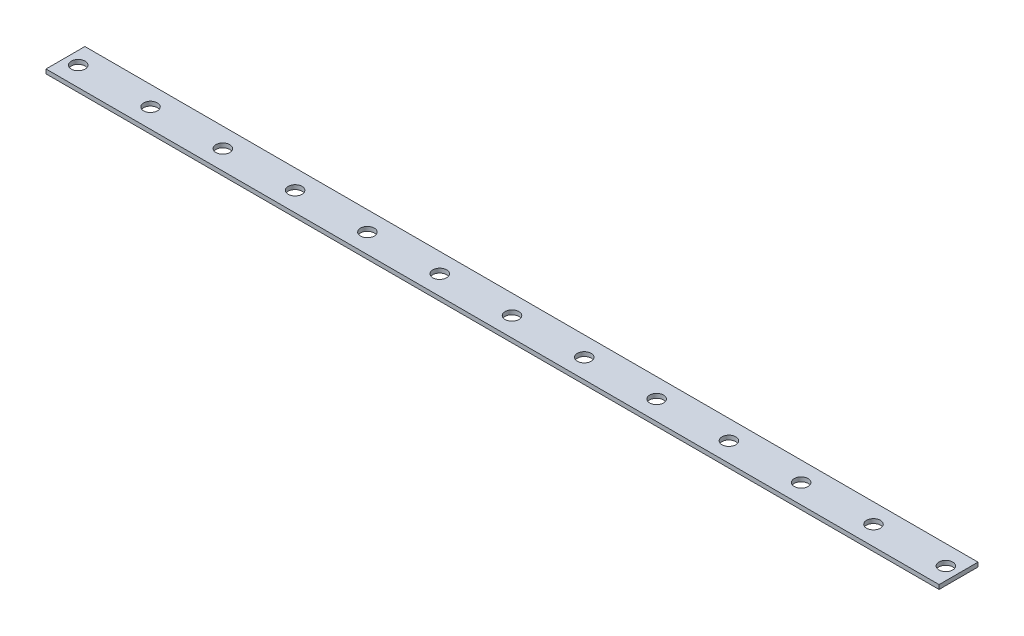
ISO-10303-21;
HEADER;
FILE_DESCRIPTION(('STEP AP214'),'2;1');
FILE_NAME('part.step','',(''),(''),'','','');
FILE_SCHEMA(('AUTOMOTIVE_DESIGN { 1 0 10303 214 1 1 1 1 }'));
ENDSEC;
DATA;
#1=APPLICATION_CONTEXT('core data for automotive mechanical design processes');
#2=APPLICATION_PROTOCOL_DEFINITION('international standard','automotive_design',2000,#1);
#3=PRODUCT_CONTEXT('',#1,'mechanical');
#4=PRODUCT('Part','Part','',(#3));
#5=PRODUCT_RELATED_PRODUCT_CATEGORY('part','',(#4));
#6=PRODUCT_DEFINITION_FORMATION('','',#4);
#7=PRODUCT_DEFINITION_CONTEXT('part definition',#1,'design');
#8=PRODUCT_DEFINITION('design','',#6,#7);
#9=PRODUCT_DEFINITION_SHAPE('','',#8);
#10=(LENGTH_UNIT() NAMED_UNIT(*) SI_UNIT(.MILLI.,.METRE.));
#11=(NAMED_UNIT(*) PLANE_ANGLE_UNIT() SI_UNIT($,.RADIAN.));
#12=(NAMED_UNIT(*) SI_UNIT($,.STERADIAN.) SOLID_ANGLE_UNIT());
#13=UNCERTAINTY_MEASURE_WITH_UNIT(LENGTH_MEASURE(1.E-05),#10,'distance_accuracy_value','');
#14=(GEOMETRIC_REPRESENTATION_CONTEXT(3) GLOBAL_UNCERTAINTY_ASSIGNED_CONTEXT((#13)) GLOBAL_UNIT_ASSIGNED_CONTEXT((#10,
#11,#12)) REPRESENTATION_CONTEXT('',''));
#15=CARTESIAN_POINT('',(0.,0.,0.));
#16=DIRECTION('',(0.,0.,1.));
#17=DIRECTION('',(1.,0.,0.));
#18=AXIS2_PLACEMENT_3D('',#15,#16,#17);
#19=CARTESIAN_POINT('',(0.,1.,0.));
#20=DIRECTION('',(0.,1.,0.));
#21=DIRECTION('',(0.,0.,1.));
#22=AXIS2_PLACEMENT_3D('',#19,#20,#21);
#23=PLANE('',#22);
#24=CARTESIAN_POINT('',(170.,1.,0.));
#25=DIRECTION('',(0.,1.,0.));
#26=DIRECTION('',(0.,0.,1.));
#27=AXIS2_PLACEMENT_3D('',#24,#25,#26);
#28=CIRCLE('',#27,3.24999999999995);
#29=CARTESIAN_POINT('',(170.,1.,3.24999999999995));
#30=VERTEX_POINT('',#29);
#31=EDGE_CURVE('E175',#30,#30,#28,.T.);
#32=ORIENTED_EDGE('',*,*,#31,.F.);
#33=EDGE_LOOP('',(#32));
#34=FACE_BOUND('',#33,.T.);
#35=CARTESIAN_POINT('',(102.,1.,0.));
#36=DIRECTION('',(0.,1.,0.));
#37=DIRECTION('',(0.,0.,1.));
#38=AXIS2_PLACEMENT_3D('',#35,#36,#37);
#39=CIRCLE('',#38,3.24999999999995);
#40=CARTESIAN_POINT('',(102.,1.,3.24999999999995));
#41=VERTEX_POINT('',#40);
#42=EDGE_CURVE('E163',#41,#41,#39,.T.);
#43=ORIENTED_EDGE('',*,*,#42,.F.);
#44=EDGE_LOOP('',(#43));
#45=FACE_BOUND('',#44,.T.);
#46=CARTESIAN_POINT('',(34.0000000000001,1.,0.));
#47=DIRECTION('',(0.,1.,0.));
#48=DIRECTION('',(0.,0.,1.));
#49=AXIS2_PLACEMENT_3D('',#46,#47,#48);
#50=CIRCLE('',#49,3.24999999999995);
#51=CARTESIAN_POINT('',(34.0000000000001,1.,3.24999999999995));
#52=VERTEX_POINT('',#51);
#53=EDGE_CURVE('E151',#52,#52,#50,.T.);
#54=ORIENTED_EDGE('',*,*,#53,.F.);
#55=EDGE_LOOP('',(#54));
#56=FACE_BOUND('',#55,.T.);
#57=CARTESIAN_POINT('',(-34.,1.,0.));
#58=DIRECTION('',(0.,1.,0.));
#59=DIRECTION('',(0.,0.,1.));
#60=AXIS2_PLACEMENT_3D('',#57,#58,#59);
#61=CIRCLE('',#60,3.24999999999996);
#62=CARTESIAN_POINT('',(-34.,1.,3.24999999999996));
#63=VERTEX_POINT('',#62);
#64=EDGE_CURVE('E139',#63,#63,#61,.T.);
#65=ORIENTED_EDGE('',*,*,#64,.F.);
#66=EDGE_LOOP('',(#65));
#67=FACE_BOUND('',#66,.T.);
#68=CARTESIAN_POINT('',(-102.,1.,0.));
#69=DIRECTION('',(0.,1.,0.));
#70=DIRECTION('',(0.,0.,1.));
#71=AXIS2_PLACEMENT_3D('',#68,#69,#70);
#72=CIRCLE('',#71,3.24999999999995);
#73=CARTESIAN_POINT('',(-102.,1.,3.24999999999995));
#74=VERTEX_POINT('',#73);
#75=EDGE_CURVE('E127',#74,#74,#72,.T.);
#76=ORIENTED_EDGE('',*,*,#75,.F.);
#77=EDGE_LOOP('',(#76));
#78=FACE_BOUND('',#77,.T.);
#79=CARTESIAN_POINT('',(-170.,1.,0.));
#80=DIRECTION('',(0.,1.,0.));
#81=DIRECTION('',(0.,0.,1.));
#82=AXIS2_PLACEMENT_3D('',#79,#80,#81);
#83=CIRCLE('',#82,3.24999999999995);
#84=CARTESIAN_POINT('',(-170.,1.,3.24999999999995));
#85=VERTEX_POINT('',#84);
#86=EDGE_CURVE('E115',#85,#85,#83,.T.);
#87=ORIENTED_EDGE('',*,*,#86,.F.);
#88=EDGE_LOOP('',(#87));
#89=FACE_BOUND('',#88,.T.);
#90=DIRECTION('',(0.,0.,-1.));
#91=VECTOR('',#90,1.);
#92=CARTESIAN_POINT('',(210.,1.,-9.15000000000005));
#93=LINE('',#92,#91);
#94=CARTESIAN_POINT('',(210.,1.,9.15000000000005));
#95=VERTEX_POINT('',#94);
#96=CARTESIAN_POINT('',(210.,1.,-9.15000000000005));
#97=VERTEX_POINT('',#96);
#98=EDGE_CURVE('E85',#95,#97,#93,.T.);
#99=ORIENTED_EDGE('',*,*,#98,.T.);
#100=DIRECTION('',(-1.,0.,0.));
#101=VECTOR('',#100,1.);
#102=CARTESIAN_POINT('',(-210.,1.,-9.15));
#103=LINE('',#102,#101);
#104=CARTESIAN_POINT('',(-210.,1.,-9.15));
#105=VERTEX_POINT('',#104);
#106=EDGE_CURVE('E80',#97,#105,#103,.T.);
#107=ORIENTED_EDGE('',*,*,#106,.T.);
#108=DIRECTION('',(0.,0.,1.));
#109=VECTOR('',#108,1.);
#110=CARTESIAN_POINT('',(-210.,1.,-9.15));
#111=LINE('',#110,#109);
#112=CARTESIAN_POINT('',(-210.,1.,9.15));
#113=VERTEX_POINT('',#112);
#114=EDGE_CURVE('E83',#105,#113,#111,.T.);
#115=ORIENTED_EDGE('',*,*,#114,.T.);
#116=DIRECTION('',(1.,0.,0.));
#117=VECTOR('',#116,1.);
#118=CARTESIAN_POINT('',(-210.,1.,9.15));
#119=LINE('',#118,#117);
#120=EDGE_CURVE('E50',#113,#95,#119,.T.);
#121=ORIENTED_EDGE('',*,*,#120,.T.);
#122=EDGE_LOOP('',(#99,#107,#115,#121));
#123=FACE_BOUND('',#122,.T.);
#124=CARTESIAN_POINT('',(-204.,1.,0.));
#125=DIRECTION('',(0.,1.,0.));
#126=DIRECTION('',(0.,0.,1.));
#127=AXIS2_PLACEMENT_3D('',#124,#125,#126);
#128=CIRCLE('',#127,3.24999999999995);
#129=CARTESIAN_POINT('',(-204.,1.,3.24999999999995));
#130=VERTEX_POINT('',#129);
#131=EDGE_CURVE('E100',#130,#130,#128,.T.);
#132=ORIENTED_EDGE('',*,*,#131,.F.);
#133=EDGE_LOOP('',(#132));
#134=FACE_BOUND('',#133,.T.);
#135=CARTESIAN_POINT('',(-136.,1.,0.));
#136=DIRECTION('',(0.,1.,0.));
#137=DIRECTION('',(0.,0.,1.));
#138=AXIS2_PLACEMENT_3D('',#135,#136,#137);
#139=CIRCLE('',#138,3.24999999999998);
#140=CARTESIAN_POINT('',(-136.,1.,3.24999999999998));
#141=VERTEX_POINT('',#140);
#142=EDGE_CURVE('E121',#141,#141,#139,.T.);
#143=ORIENTED_EDGE('',*,*,#142,.F.);
#144=EDGE_LOOP('',(#143));
#145=FACE_BOUND('',#144,.T.);
#146=CARTESIAN_POINT('',(-67.9999999999999,1.,0.));
#147=DIRECTION('',(0.,1.,0.));
#148=DIRECTION('',(0.,0.,1.));
#149=AXIS2_PLACEMENT_3D('',#146,#147,#148);
#150=CIRCLE('',#149,3.24999999999995);
#151=CARTESIAN_POINT('',(-67.9999999999999,1.,3.24999999999995));
#152=VERTEX_POINT('',#151);
#153=EDGE_CURVE('E133',#152,#152,#150,.T.);
#154=ORIENTED_EDGE('',*,*,#153,.F.);
#155=EDGE_LOOP('',(#154));
#156=FACE_BOUND('',#155,.T.);
#157=CARTESIAN_POINT('',(0.,1.,0.));
#158=DIRECTION('',(0.,1.,0.));
#159=DIRECTION('',(0.,0.,1.));
#160=AXIS2_PLACEMENT_3D('',#157,#158,#159);
#161=CIRCLE('',#160,3.24999999999995);
#162=CARTESIAN_POINT('',(0.,1.,3.24999999999995));
#163=VERTEX_POINT('',#162);
#164=EDGE_CURVE('E145',#163,#163,#161,.T.);
#165=ORIENTED_EDGE('',*,*,#164,.F.);
#166=EDGE_LOOP('',(#165));
#167=FACE_BOUND('',#166,.T.);
#168=CARTESIAN_POINT('',(68.0000000000001,1.,0.));
#169=DIRECTION('',(0.,1.,0.));
#170=DIRECTION('',(0.,0.,1.));
#171=AXIS2_PLACEMENT_3D('',#168,#169,#170);
#172=CIRCLE('',#171,3.24999999999995);
#173=CARTESIAN_POINT('',(68.0000000000001,1.,3.24999999999995));
#174=VERTEX_POINT('',#173);
#175=EDGE_CURVE('E157',#174,#174,#172,.T.);
#176=ORIENTED_EDGE('',*,*,#175,.F.);
#177=EDGE_LOOP('',(#176));
#178=FACE_BOUND('',#177,.T.);
#179=CARTESIAN_POINT('',(136.,1.,0.));
#180=DIRECTION('',(0.,1.,0.));
#181=DIRECTION('',(0.,0.,1.));
#182=AXIS2_PLACEMENT_3D('',#179,#180,#181);
#183=CIRCLE('',#182,3.24999999999995);
#184=CARTESIAN_POINT('',(136.,1.,3.24999999999995));
#185=VERTEX_POINT('',#184);
#186=EDGE_CURVE('E169',#185,#185,#183,.T.);
#187=ORIENTED_EDGE('',*,*,#186,.F.);
#188=EDGE_LOOP('',(#187));
#189=FACE_BOUND('',#188,.T.);
#190=CARTESIAN_POINT('',(204.,1.,0.));
#191=DIRECTION('',(0.,1.,0.));
#192=DIRECTION('',(0.,0.,1.));
#193=AXIS2_PLACEMENT_3D('',#190,#191,#192);
#194=CIRCLE('',#193,3.24999999999995);
#195=CARTESIAN_POINT('',(204.,1.,3.24999999999995));
#196=VERTEX_POINT('',#195);
#197=EDGE_CURVE('E181',#196,#196,#194,.T.);
#198=ORIENTED_EDGE('',*,*,#197,.F.);
#199=EDGE_LOOP('',(#198));
#200=FACE_BOUND('',#199,.T.);
#201=ADVANCED_FACE('F33',(#34,#45,#56,#67,#78,#89,#123,#134,#145,#156,#167,#178,#189,#200),#23,.T.);
#202=CARTESIAN_POINT('',(0.,-1.,0.));
#203=DIRECTION('',(0.,1.,0.));
#204=DIRECTION('',(0.,0.,1.));
#205=AXIS2_PLACEMENT_3D('',#202,#203,#204);
#206=PLANE('',#205);
#207=DIRECTION('',(0.,0.,-1.));
#208=VECTOR('',#207,1.);
#209=CARTESIAN_POINT('',(210.,-1.,-9.15000000000005));
#210=LINE('',#209,#208);
#211=CARTESIAN_POINT('',(210.,-1.,9.15000000000005));
#212=VERTEX_POINT('',#211);
#213=CARTESIAN_POINT('',(210.,-1.,-9.15000000000005));
#214=VERTEX_POINT('',#213);
#215=EDGE_CURVE('E97',#212,#214,#210,.T.);
#216=ORIENTED_EDGE('',*,*,#215,.F.);
#217=DIRECTION('',(1.,0.,0.));
#218=VECTOR('',#217,1.);
#219=CARTESIAN_POINT('',(-210.,-1.,9.15));
#220=LINE('',#219,#218);
#221=CARTESIAN_POINT('',(-210.,-1.,9.15));
#222=VERTEX_POINT('',#221);
#223=EDGE_CURVE('E73',#222,#212,#220,.T.);
#224=ORIENTED_EDGE('',*,*,#223,.F.);
#225=DIRECTION('',(0.,0.,1.));
#226=VECTOR('',#225,1.);
#227=CARTESIAN_POINT('',(-210.,-1.,-9.15));
#228=LINE('',#227,#226);
#229=CARTESIAN_POINT('',(-210.,-1.,-9.15));
#230=VERTEX_POINT('',#229);
#231=EDGE_CURVE('E67',#230,#222,#228,.T.);
#232=ORIENTED_EDGE('',*,*,#231,.F.);
#233=DIRECTION('',(-1.,0.,0.));
#234=VECTOR('',#233,1.);
#235=CARTESIAN_POINT('',(-210.,-1.,-9.15));
#236=LINE('',#235,#234);
#237=EDGE_CURVE('E89',#214,#230,#236,.T.);
#238=ORIENTED_EDGE('',*,*,#237,.F.);
#239=EDGE_LOOP('',(#216,#224,#232,#238));
#240=FACE_BOUND('',#239,.T.);
#241=CARTESIAN_POINT('',(-204.,-1.,0.));
#242=DIRECTION('',(0.,1.,0.));
#243=DIRECTION('',(0.,0.,1.));
#244=AXIS2_PLACEMENT_3D('',#241,#242,#243);
#245=CIRCLE('',#244,3.24999999999995);
#246=CARTESIAN_POINT('',(-204.,-1.,3.24999999999995));
#247=VERTEX_POINT('',#246);
#248=EDGE_CURVE('E112',#247,#247,#245,.T.);
#249=ORIENTED_EDGE('',*,*,#248,.T.);
#250=EDGE_LOOP('',(#249));
#251=FACE_BOUND('',#250,.T.);
#252=CARTESIAN_POINT('',(-170.,-1.,0.));
#253=DIRECTION('',(0.,1.,0.));
#254=DIRECTION('',(0.,0.,1.));
#255=AXIS2_PLACEMENT_3D('',#252,#253,#254);
#256=CIRCLE('',#255,3.24999999999995);
#257=CARTESIAN_POINT('',(-170.,-1.,3.24999999999995));
#258=VERTEX_POINT('',#257);
#259=EDGE_CURVE('E118',#258,#258,#256,.T.);
#260=ORIENTED_EDGE('',*,*,#259,.T.);
#261=EDGE_LOOP('',(#260));
#262=FACE_BOUND('',#261,.T.);
#263=CARTESIAN_POINT('',(-136.,-1.,0.));
#264=DIRECTION('',(0.,1.,0.));
#265=DIRECTION('',(0.,0.,1.));
#266=AXIS2_PLACEMENT_3D('',#263,#264,#265);
#267=CIRCLE('',#266,3.24999999999998);
#268=CARTESIAN_POINT('',(-136.,-1.,3.24999999999998));
#269=VERTEX_POINT('',#268);
#270=EDGE_CURVE('E124',#269,#269,#267,.T.);
#271=ORIENTED_EDGE('',*,*,#270,.T.);
#272=EDGE_LOOP('',(#271));
#273=FACE_BOUND('',#272,.T.);
#274=CARTESIAN_POINT('',(-102.,-1.,0.));
#275=DIRECTION('',(0.,1.,0.));
#276=DIRECTION('',(0.,0.,1.));
#277=AXIS2_PLACEMENT_3D('',#274,#275,#276);
#278=CIRCLE('',#277,3.24999999999995);
#279=CARTESIAN_POINT('',(-102.,-1.,3.24999999999995));
#280=VERTEX_POINT('',#279);
#281=EDGE_CURVE('E130',#280,#280,#278,.T.);
#282=ORIENTED_EDGE('',*,*,#281,.T.);
#283=EDGE_LOOP('',(#282));
#284=FACE_BOUND('',#283,.T.);
#285=CARTESIAN_POINT('',(-67.9999999999999,-1.,0.));
#286=DIRECTION('',(0.,1.,0.));
#287=DIRECTION('',(0.,0.,1.));
#288=AXIS2_PLACEMENT_3D('',#285,#286,#287);
#289=CIRCLE('',#288,3.24999999999995);
#290=CARTESIAN_POINT('',(-67.9999999999999,-1.,3.24999999999995));
#291=VERTEX_POINT('',#290);
#292=EDGE_CURVE('E136',#291,#291,#289,.T.);
#293=ORIENTED_EDGE('',*,*,#292,.T.);
#294=EDGE_LOOP('',(#293));
#295=FACE_BOUND('',#294,.T.);
#296=CARTESIAN_POINT('',(-34.,-1.,0.));
#297=DIRECTION('',(0.,1.,0.));
#298=DIRECTION('',(0.,0.,1.));
#299=AXIS2_PLACEMENT_3D('',#296,#297,#298);
#300=CIRCLE('',#299,3.24999999999996);
#301=CARTESIAN_POINT('',(-34.,-1.,3.24999999999996));
#302=VERTEX_POINT('',#301);
#303=EDGE_CURVE('E142',#302,#302,#300,.T.);
#304=ORIENTED_EDGE('',*,*,#303,.T.);
#305=EDGE_LOOP('',(#304));
#306=FACE_BOUND('',#305,.T.);
#307=CARTESIAN_POINT('',(0.,-1.,0.));
#308=DIRECTION('',(0.,1.,0.));
#309=DIRECTION('',(0.,0.,1.));
#310=AXIS2_PLACEMENT_3D('',#307,#308,#309);
#311=CIRCLE('',#310,3.24999999999995);
#312=CARTESIAN_POINT('',(0.,-1.,3.24999999999995));
#313=VERTEX_POINT('',#312);
#314=EDGE_CURVE('E148',#313,#313,#311,.T.);
#315=ORIENTED_EDGE('',*,*,#314,.T.);
#316=EDGE_LOOP('',(#315));
#317=FACE_BOUND('',#316,.T.);
#318=CARTESIAN_POINT('',(34.0000000000001,-1.,0.));
#319=DIRECTION('',(0.,1.,0.));
#320=DIRECTION('',(0.,0.,1.));
#321=AXIS2_PLACEMENT_3D('',#318,#319,#320);
#322=CIRCLE('',#321,3.24999999999995);
#323=CARTESIAN_POINT('',(34.0000000000001,-1.,3.24999999999995));
#324=VERTEX_POINT('',#323);
#325=EDGE_CURVE('E154',#324,#324,#322,.T.);
#326=ORIENTED_EDGE('',*,*,#325,.T.);
#327=EDGE_LOOP('',(#326));
#328=FACE_BOUND('',#327,.T.);
#329=CARTESIAN_POINT('',(68.0000000000001,-1.,0.));
#330=DIRECTION('',(0.,1.,0.));
#331=DIRECTION('',(0.,0.,1.));
#332=AXIS2_PLACEMENT_3D('',#329,#330,#331);
#333=CIRCLE('',#332,3.24999999999995);
#334=CARTESIAN_POINT('',(68.0000000000001,-1.,3.24999999999995));
#335=VERTEX_POINT('',#334);
#336=EDGE_CURVE('E160',#335,#335,#333,.T.);
#337=ORIENTED_EDGE('',*,*,#336,.T.);
#338=EDGE_LOOP('',(#337));
#339=FACE_BOUND('',#338,.T.);
#340=CARTESIAN_POINT('',(102.,-1.,0.));
#341=DIRECTION('',(0.,1.,0.));
#342=DIRECTION('',(0.,0.,1.));
#343=AXIS2_PLACEMENT_3D('',#340,#341,#342);
#344=CIRCLE('',#343,3.24999999999995);
#345=CARTESIAN_POINT('',(102.,-1.,3.24999999999995));
#346=VERTEX_POINT('',#345);
#347=EDGE_CURVE('E166',#346,#346,#344,.T.);
#348=ORIENTED_EDGE('',*,*,#347,.T.);
#349=EDGE_LOOP('',(#348));
#350=FACE_BOUND('',#349,.T.);
#351=CARTESIAN_POINT('',(136.,-1.,0.));
#352=DIRECTION('',(0.,1.,0.));
#353=DIRECTION('',(0.,0.,1.));
#354=AXIS2_PLACEMENT_3D('',#351,#352,#353);
#355=CIRCLE('',#354,3.24999999999995);
#356=CARTESIAN_POINT('',(136.,-1.,3.24999999999995));
#357=VERTEX_POINT('',#356);
#358=EDGE_CURVE('E172',#357,#357,#355,.T.);
#359=ORIENTED_EDGE('',*,*,#358,.T.);
#360=EDGE_LOOP('',(#359));
#361=FACE_BOUND('',#360,.T.);
#362=CARTESIAN_POINT('',(170.,-1.,0.));
#363=DIRECTION('',(0.,1.,0.));
#364=DIRECTION('',(0.,0.,1.));
#365=AXIS2_PLACEMENT_3D('',#362,#363,#364);
#366=CIRCLE('',#365,3.24999999999995);
#367=CARTESIAN_POINT('',(170.,-1.,3.24999999999995));
#368=VERTEX_POINT('',#367);
#369=EDGE_CURVE('E178',#368,#368,#366,.T.);
#370=ORIENTED_EDGE('',*,*,#369,.T.);
#371=EDGE_LOOP('',(#370));
#372=FACE_BOUND('',#371,.T.);
#373=CARTESIAN_POINT('',(204.,-1.,0.));
#374=DIRECTION('',(0.,1.,0.));
#375=DIRECTION('',(0.,0.,1.));
#376=AXIS2_PLACEMENT_3D('',#373,#374,#375);
#377=CIRCLE('',#376,3.24999999999995);
#378=CARTESIAN_POINT('',(204.,-1.,3.24999999999995));
#379=VERTEX_POINT('',#378);
#380=EDGE_CURVE('E184',#379,#379,#377,.T.);
#381=ORIENTED_EDGE('',*,*,#380,.T.);
#382=EDGE_LOOP('',(#381));
#383=FACE_BOUND('',#382,.T.);
#384=ADVANCED_FACE('F108',(#240,#251,#262,#273,#284,#295,#306,#317,#328,#339,#350,#361,#372,
#383),#206,.F.);
#385=CARTESIAN_POINT('',(210.,1.,-9.15000000000005));
#386=DIRECTION('',(-1.,0.,0.));
#387=DIRECTION('',(0.,0.,1.));
#388=AXIS2_PLACEMENT_3D('',#385,#386,#387);
#389=PLANE('',#388);
#390=ORIENTED_EDGE('',*,*,#215,.T.);
#391=DIRECTION('',(0.,-1.,0.));
#392=VECTOR('',#391,1.);
#393=CARTESIAN_POINT('',(210.,1.,-9.15000000000005));
#394=LINE('',#393,#392);
#395=EDGE_CURVE('E11',#97,#214,#394,.T.);
#396=ORIENTED_EDGE('',*,*,#395,.F.);
#397=ORIENTED_EDGE('',*,*,#98,.F.);
#398=DIRECTION('',(0.,-1.,0.));
#399=VECTOR('',#398,1.);
#400=CARTESIAN_POINT('',(210.,1.,9.15000000000005));
#401=LINE('',#400,#399);
#402=EDGE_CURVE('E93',#95,#212,#401,.T.);
#403=ORIENTED_EDGE('',*,*,#402,.T.);
#404=EDGE_LOOP('',(#390,#396,#397,#403));
#405=FACE_BOUND('',#404,.T.);
#406=ADVANCED_FACE('F35',(#405),#389,.F.);
#407=CARTESIAN_POINT('',(-210.,1.,-9.15));
#408=DIRECTION('',(0.,0.,1.));
#409=DIRECTION('',(1.,0.,0.));
#410=AXIS2_PLACEMENT_3D('',#407,#408,#409);
#411=PLANE('',#410);
#412=ORIENTED_EDGE('',*,*,#237,.T.);
#413=DIRECTION('',(0.,-1.,0.));
#414=VECTOR('',#413,1.);
#415=CARTESIAN_POINT('',(-210.,1.,-9.15));
#416=LINE('',#415,#414);
#417=EDGE_CURVE('E42',#105,#230,#416,.T.);
#418=ORIENTED_EDGE('',*,*,#417,.F.);
#419=ORIENTED_EDGE('',*,*,#106,.F.);
#420=ORIENTED_EDGE('',*,*,#395,.T.);
#421=EDGE_LOOP('',(#412,#418,#419,#420));
#422=FACE_BOUND('',#421,.T.);
#423=ADVANCED_FACE('F88',(#422),#411,.F.);
#424=CARTESIAN_POINT('',(-210.,1.,-9.15));
#425=DIRECTION('',(1.,0.,0.));
#426=DIRECTION('',(0.,0.,-1.));
#427=AXIS2_PLACEMENT_3D('',#424,#425,#426);
#428=PLANE('',#427);
#429=ORIENTED_EDGE('',*,*,#231,.T.);
#430=DIRECTION('',(0.,-1.,0.));
#431=VECTOR('',#430,1.);
#432=CARTESIAN_POINT('',(-210.,1.,9.15));
#433=LINE('',#432,#431);
#434=EDGE_CURVE('E90',#113,#222,#433,.T.);
#435=ORIENTED_EDGE('',*,*,#434,.F.);
#436=ORIENTED_EDGE('',*,*,#114,.F.);
#437=ORIENTED_EDGE('',*,*,#417,.T.);
#438=EDGE_LOOP('',(#429,#435,#436,#437));
#439=FACE_BOUND('',#438,.T.);
#440=ADVANCED_FACE('F91',(#439),#428,.F.);
#441=CARTESIAN_POINT('',(-210.,1.,9.15));
#442=DIRECTION('',(0.,0.,-1.));
#443=DIRECTION('',(-1.,0.,0.));
#444=AXIS2_PLACEMENT_3D('',#441,#442,#443);
#445=PLANE('',#444);
#446=ORIENTED_EDGE('',*,*,#223,.T.);
#447=ORIENTED_EDGE('',*,*,#402,.F.);
#448=ORIENTED_EDGE('',*,*,#120,.F.);
#449=ORIENTED_EDGE('',*,*,#434,.T.);
#450=EDGE_LOOP('',(#446,#447,#448,#449));
#451=FACE_BOUND('',#450,.T.);
#452=ADVANCED_FACE('F105',(#451),#445,.F.);
#453=CARTESIAN_POINT('',(-204.,1.,0.));
#454=DIRECTION('',(0.,-1.,0.));
#455=DIRECTION('',(0.,0.,-1.));
#456=AXIS2_PLACEMENT_3D('',#453,#454,#455);
#457=CYLINDRICAL_SURFACE('',#456,3.24999999999995);
#458=ORIENTED_EDGE('',*,*,#131,.T.);
#459=EDGE_LOOP('',(#458));
#460=FACE_BOUND('',#459,.T.);
#461=ORIENTED_EDGE('',*,*,#248,.F.);
#462=EDGE_LOOP('',(#461));
#463=FACE_BOUND('',#462,.T.);
#464=ADVANCED_FACE('F203',(#460,#463),#457,.F.);
#465=CARTESIAN_POINT('',(-170.,1.,0.));
#466=DIRECTION('',(0.,-1.,0.));
#467=DIRECTION('',(0.,0.,-1.));
#468=AXIS2_PLACEMENT_3D('',#465,#466,#467);
#469=CYLINDRICAL_SURFACE('',#468,3.24999999999995);
#470=ORIENTED_EDGE('',*,*,#86,.T.);
#471=EDGE_LOOP('',(#470));
#472=FACE_BOUND('',#471,.T.);
#473=ORIENTED_EDGE('',*,*,#259,.F.);
#474=EDGE_LOOP('',(#473));
#475=FACE_BOUND('',#474,.T.);
#476=ADVANCED_FACE('F249',(#472,#475),#469,.F.);
#477=CARTESIAN_POINT('',(-136.,1.,0.));
#478=DIRECTION('',(0.,-1.,0.));
#479=DIRECTION('',(0.,0.,-1.));
#480=AXIS2_PLACEMENT_3D('',#477,#478,#479);
#481=CYLINDRICAL_SURFACE('',#480,3.24999999999998);
#482=ORIENTED_EDGE('',*,*,#142,.T.);
#483=EDGE_LOOP('',(#482));
#484=FACE_BOUND('',#483,.T.);
#485=ORIENTED_EDGE('',*,*,#270,.F.);
#486=EDGE_LOOP('',(#485));
#487=FACE_BOUND('',#486,.T.);
#488=ADVANCED_FACE('F257',(#484,#487),#481,.F.);
#489=CARTESIAN_POINT('',(-102.,1.,0.));
#490=DIRECTION('',(0.,-1.,0.));
#491=DIRECTION('',(0.,0.,-1.));
#492=AXIS2_PLACEMENT_3D('',#489,#490,#491);
#493=CYLINDRICAL_SURFACE('',#492,3.24999999999995);
#494=ORIENTED_EDGE('',*,*,#75,.T.);
#495=EDGE_LOOP('',(#494));
#496=FACE_BOUND('',#495,.T.);
#497=ORIENTED_EDGE('',*,*,#281,.F.);
#498=EDGE_LOOP('',(#497));
#499=FACE_BOUND('',#498,.T.);
#500=ADVANCED_FACE('F265',(#496,#499),#493,.F.);
#501=CARTESIAN_POINT('',(-67.9999999999999,1.,0.));
#502=DIRECTION('',(0.,-1.,0.));
#503=DIRECTION('',(0.,0.,-1.));
#504=AXIS2_PLACEMENT_3D('',#501,#502,#503);
#505=CYLINDRICAL_SURFACE('',#504,3.24999999999995);
#506=ORIENTED_EDGE('',*,*,#153,.T.);
#507=EDGE_LOOP('',(#506));
#508=FACE_BOUND('',#507,.T.);
#509=ORIENTED_EDGE('',*,*,#292,.F.);
#510=EDGE_LOOP('',(#509));
#511=FACE_BOUND('',#510,.T.);
#512=ADVANCED_FACE('F274',(#508,#511),#505,.F.);
#513=CARTESIAN_POINT('',(-34.,1.,0.));
#514=DIRECTION('',(0.,-1.,0.));
#515=DIRECTION('',(0.,0.,-1.));
#516=AXIS2_PLACEMENT_3D('',#513,#514,#515);
#517=CYLINDRICAL_SURFACE('',#516,3.24999999999996);
#518=ORIENTED_EDGE('',*,*,#64,.T.);
#519=EDGE_LOOP('',(#518));
#520=FACE_BOUND('',#519,.T.);
#521=ORIENTED_EDGE('',*,*,#303,.F.);
#522=EDGE_LOOP('',(#521));
#523=FACE_BOUND('',#522,.T.);
#524=ADVANCED_FACE('F283',(#520,#523),#517,.F.);
#525=CARTESIAN_POINT('',(0.,1.,0.));
#526=DIRECTION('',(0.,-1.,0.));
#527=DIRECTION('',(0.,0.,-1.));
#528=AXIS2_PLACEMENT_3D('',#525,#526,#527);
#529=CYLINDRICAL_SURFACE('',#528,3.24999999999995);
#530=ORIENTED_EDGE('',*,*,#164,.T.);
#531=EDGE_LOOP('',(#530));
#532=FACE_BOUND('',#531,.T.);
#533=ORIENTED_EDGE('',*,*,#314,.F.);
#534=EDGE_LOOP('',(#533));
#535=FACE_BOUND('',#534,.T.);
#536=ADVANCED_FACE('F292',(#532,#535),#529,.F.);
#537=CARTESIAN_POINT('',(34.0000000000001,1.,0.));
#538=DIRECTION('',(0.,-1.,0.));
#539=DIRECTION('',(0.,0.,-1.));
#540=AXIS2_PLACEMENT_3D('',#537,#538,#539);
#541=CYLINDRICAL_SURFACE('',#540,3.24999999999995);
#542=ORIENTED_EDGE('',*,*,#53,.T.);
#543=EDGE_LOOP('',(#542));
#544=FACE_BOUND('',#543,.T.);
#545=ORIENTED_EDGE('',*,*,#325,.F.);
#546=EDGE_LOOP('',(#545));
#547=FACE_BOUND('',#546,.T.);
#548=ADVANCED_FACE('F301',(#544,#547),#541,.F.);
#549=CARTESIAN_POINT('',(68.0000000000001,1.,0.));
#550=DIRECTION('',(0.,-1.,0.));
#551=DIRECTION('',(0.,0.,-1.));
#552=AXIS2_PLACEMENT_3D('',#549,#550,#551);
#553=CYLINDRICAL_SURFACE('',#552,3.24999999999995);
#554=ORIENTED_EDGE('',*,*,#175,.T.);
#555=EDGE_LOOP('',(#554));
#556=FACE_BOUND('',#555,.T.);
#557=ORIENTED_EDGE('',*,*,#336,.F.);
#558=EDGE_LOOP('',(#557));
#559=FACE_BOUND('',#558,.T.);
#560=ADVANCED_FACE('F310',(#556,#559),#553,.F.);
#561=CARTESIAN_POINT('',(102.,1.,0.));
#562=DIRECTION('',(0.,-1.,0.));
#563=DIRECTION('',(0.,0.,-1.));
#564=AXIS2_PLACEMENT_3D('',#561,#562,#563);
#565=CYLINDRICAL_SURFACE('',#564,3.24999999999995);
#566=ORIENTED_EDGE('',*,*,#42,.T.);
#567=EDGE_LOOP('',(#566));
#568=FACE_BOUND('',#567,.T.);
#569=ORIENTED_EDGE('',*,*,#347,.F.);
#570=EDGE_LOOP('',(#569));
#571=FACE_BOUND('',#570,.T.);
#572=ADVANCED_FACE('F319',(#568,#571),#565,.F.);
#573=CARTESIAN_POINT('',(136.,1.,0.));
#574=DIRECTION('',(0.,-1.,0.));
#575=DIRECTION('',(0.,0.,-1.));
#576=AXIS2_PLACEMENT_3D('',#573,#574,#575);
#577=CYLINDRICAL_SURFACE('',#576,3.24999999999995);
#578=ORIENTED_EDGE('',*,*,#186,.T.);
#579=EDGE_LOOP('',(#578));
#580=FACE_BOUND('',#579,.T.);
#581=ORIENTED_EDGE('',*,*,#358,.F.);
#582=EDGE_LOOP('',(#581));
#583=FACE_BOUND('',#582,.T.);
#584=ADVANCED_FACE('F328',(#580,#583),#577,.F.);
#585=CARTESIAN_POINT('',(170.,1.,0.));
#586=DIRECTION('',(0.,-1.,0.));
#587=DIRECTION('',(0.,0.,-1.));
#588=AXIS2_PLACEMENT_3D('',#585,#586,#587);
#589=CYLINDRICAL_SURFACE('',#588,3.24999999999995);
#590=ORIENTED_EDGE('',*,*,#31,.T.);
#591=EDGE_LOOP('',(#590));
#592=FACE_BOUND('',#591,.T.);
#593=ORIENTED_EDGE('',*,*,#369,.F.);
#594=EDGE_LOOP('',(#593));
#595=FACE_BOUND('',#594,.T.);
#596=ADVANCED_FACE('F337',(#592,#595),#589,.F.);
#597=CARTESIAN_POINT('',(204.,1.,0.));
#598=DIRECTION('',(0.,-1.,0.));
#599=DIRECTION('',(0.,0.,-1.));
#600=AXIS2_PLACEMENT_3D('',#597,#598,#599);
#601=CYLINDRICAL_SURFACE('',#600,3.24999999999995);
#602=ORIENTED_EDGE('',*,*,#197,.T.);
#603=EDGE_LOOP('',(#602));
#604=FACE_BOUND('',#603,.T.);
#605=ORIENTED_EDGE('',*,*,#380,.F.);
#606=EDGE_LOOP('',(#605));
#607=FACE_BOUND('',#606,.T.);
#608=ADVANCED_FACE('F190',(#604,#607),#601,.F.);
#609=CLOSED_SHELL('',(#201,#384,#406,#423,#440,#452,#464,#476,#488,#500,#512,#524,#536,#548,
#560,#572,#584,#596,#608));
#610=MANIFOLD_SOLID_BREP('B2',#609);
#611=ADVANCED_BREP_SHAPE_REPRESENTATION('',(#18,#610),#14);
#612=SHAPE_DEFINITION_REPRESENTATION(#9,#611);
ENDSEC;
END-ISO-10303-21;
